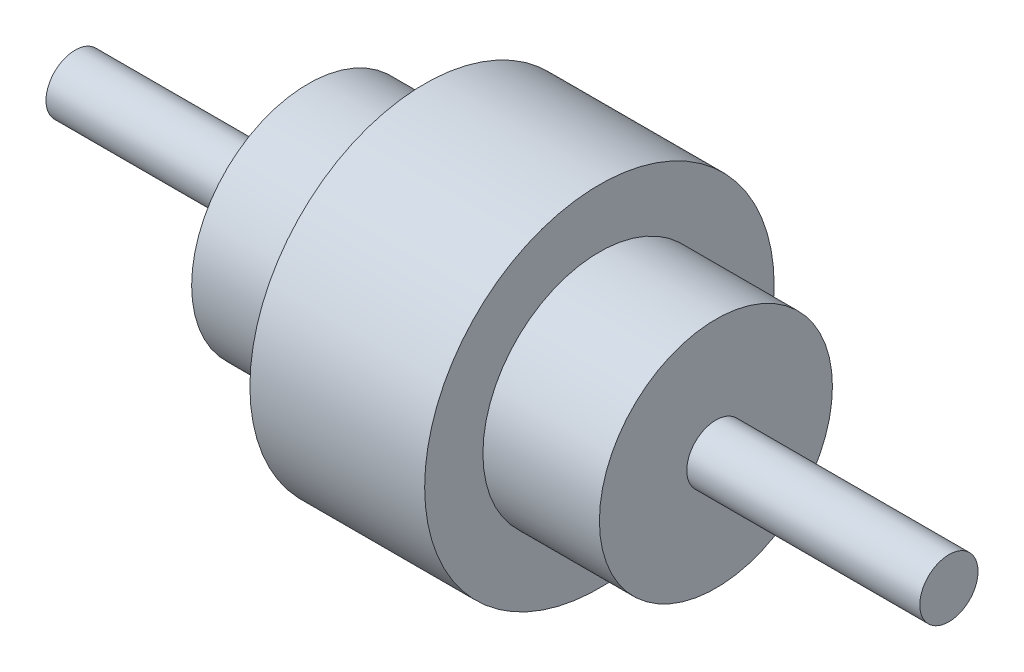
ISO-10303-21;
HEADER;
FILE_DESCRIPTION(('STEP AP214'),'2;1');
FILE_NAME('part.step','',(''),(''),'','','');
FILE_SCHEMA(('AUTOMOTIVE_DESIGN { 1 0 10303 214 1 1 1 1 }'));
ENDSEC;
DATA;
#1=APPLICATION_CONTEXT('core data for automotive mechanical design processes');
#2=APPLICATION_PROTOCOL_DEFINITION('international standard','automotive_design',2000,#1);
#3=PRODUCT_CONTEXT('',#1,'mechanical');
#4=PRODUCT('Part','Part','',(#3));
#5=PRODUCT_RELATED_PRODUCT_CATEGORY('part','',(#4));
#6=PRODUCT_DEFINITION_FORMATION('','',#4);
#7=PRODUCT_DEFINITION_CONTEXT('part definition',#1,'design');
#8=PRODUCT_DEFINITION('design','',#6,#7);
#9=PRODUCT_DEFINITION_SHAPE('','',#8);
#10=(LENGTH_UNIT() NAMED_UNIT(*) SI_UNIT(.MILLI.,.METRE.));
#11=(NAMED_UNIT(*) PLANE_ANGLE_UNIT() SI_UNIT($,.RADIAN.));
#12=(NAMED_UNIT(*) SI_UNIT($,.STERADIAN.) SOLID_ANGLE_UNIT());
#13=UNCERTAINTY_MEASURE_WITH_UNIT(LENGTH_MEASURE(1.E-05),#10,'distance_accuracy_value','');
#14=(GEOMETRIC_REPRESENTATION_CONTEXT(3) GLOBAL_UNCERTAINTY_ASSIGNED_CONTEXT((#13)) GLOBAL_UNIT_ASSIGNED_CONTEXT((#10,
#11,#12)) REPRESENTATION_CONTEXT('',''));
#15=CARTESIAN_POINT('',(0.,0.,0.));
#16=DIRECTION('',(0.,0.,1.));
#17=DIRECTION('',(1.,0.,0.));
#18=AXIS2_PLACEMENT_3D('',#15,#16,#17);
#19=CARTESIAN_POINT('',(0.,0.,0.));
#20=DIRECTION('',(-1.,0.,0.));
#21=DIRECTION('',(0.,0.,1.));
#22=AXIS2_PLACEMENT_3D('',#19,#20,#21);
#23=PLANE('',#22);
#24=CARTESIAN_POINT('',(0.,0.,0.));
#25=DIRECTION('',(-1.,0.,0.));
#26=DIRECTION('',(0.,0.,1.));
#27=AXIS2_PLACEMENT_3D('',#24,#25,#26);
#28=CIRCLE('',#27,10.);
#29=CARTESIAN_POINT('',(0.,0.,10.));
#30=VERTEX_POINT('',#29);
#31=EDGE_CURVE('E10',#30,#30,#28,.T.);
#32=ORIENTED_EDGE('',*,*,#31,.T.);
#33=EDGE_LOOP('',(#32));
#34=FACE_BOUND('',#33,.T.);
#35=ADVANCED_FACE('F41',(#34),#23,.T.);
#36=CARTESIAN_POINT('',(0.,0.,0.));
#37=DIRECTION('',(-1.,0.,0.));
#38=DIRECTION('',(0.,0.,1.));
#39=AXIS2_PLACEMENT_3D('',#36,#37,#38);
#40=CYLINDRICAL_SURFACE('',#39,10.);
#41=CARTESIAN_POINT('',(80.,0.,0.));
#42=DIRECTION('',(-1.,0.,0.));
#43=DIRECTION('',(0.,0.,1.));
#44=AXIS2_PLACEMENT_3D('',#41,#42,#43);
#45=CIRCLE('',#44,10.);
#46=CARTESIAN_POINT('',(80.,0.,10.));
#47=VERTEX_POINT('',#46);
#48=EDGE_CURVE('E48',#47,#47,#45,.T.);
#49=ORIENTED_EDGE('',*,*,#48,.T.);
#50=EDGE_LOOP('',(#49));
#51=FACE_BOUND('',#50,.T.);
#52=ORIENTED_EDGE('',*,*,#31,.F.);
#53=EDGE_LOOP('',(#52));
#54=FACE_BOUND('',#53,.T.);
#55=ADVANCED_FACE('F101',(#51,#54),#40,.T.);
#56=CARTESIAN_POINT('',(80.,0.,10.));
#57=DIRECTION('',(-1.,0.,0.));
#58=DIRECTION('',(0.,0.,1.));
#59=AXIS2_PLACEMENT_3D('',#56,#57,#58);
#60=PLANE('',#59);
#61=CARTESIAN_POINT('',(80.,0.,0.));
#62=DIRECTION('',(-1.,0.,0.));
#63=DIRECTION('',(0.,0.,1.));
#64=AXIS2_PLACEMENT_3D('',#61,#62,#63);
#65=CIRCLE('',#64,40.);
#66=CARTESIAN_POINT('',(80.,0.,40.));
#67=VERTEX_POINT('',#66);
#68=EDGE_CURVE('E53',#67,#67,#65,.T.);
#69=ORIENTED_EDGE('',*,*,#68,.T.);
#70=EDGE_LOOP('',(#69));
#71=FACE_BOUND('',#70,.T.);
#72=ORIENTED_EDGE('',*,*,#48,.F.);
#73=EDGE_LOOP('',(#72));
#74=FACE_BOUND('',#73,.T.);
#75=ADVANCED_FACE('F105',(#71,#74),#60,.T.);
#76=CARTESIAN_POINT('',(0.,0.,0.));
#77=DIRECTION('',(-1.,0.,0.));
#78=DIRECTION('',(0.,0.,1.));
#79=AXIS2_PLACEMENT_3D('',#76,#77,#78);
#80=CYLINDRICAL_SURFACE('',#79,40.);
#81=CARTESIAN_POINT('',(120.,0.,0.));
#82=DIRECTION('',(-1.,0.,0.));
#83=DIRECTION('',(0.,0.,1.));
#84=AXIS2_PLACEMENT_3D('',#81,#82,#83);
#85=CIRCLE('',#84,40.);
#86=CARTESIAN_POINT('',(120.,0.,40.));
#87=VERTEX_POINT('',#86);
#88=EDGE_CURVE('E58',#87,#87,#85,.T.);
#89=ORIENTED_EDGE('',*,*,#88,.T.);
#90=EDGE_LOOP('',(#89));
#91=FACE_BOUND('',#90,.T.);
#92=ORIENTED_EDGE('',*,*,#68,.F.);
#93=EDGE_LOOP('',(#92));
#94=FACE_BOUND('',#93,.T.);
#95=ADVANCED_FACE('F109',(#91,#94),#80,.T.);
#96=CARTESIAN_POINT('',(120.,0.,40.));
#97=DIRECTION('',(-1.,0.,0.));
#98=DIRECTION('',(0.,0.,1.));
#99=AXIS2_PLACEMENT_3D('',#96,#97,#98);
#100=PLANE('',#99);
#101=CARTESIAN_POINT('',(120.,0.,0.));
#102=DIRECTION('',(-1.,0.,0.));
#103=DIRECTION('',(0.,0.,1.));
#104=AXIS2_PLACEMENT_3D('',#101,#102,#103);
#105=CIRCLE('',#104,60.);
#106=CARTESIAN_POINT('',(120.,0.,60.));
#107=VERTEX_POINT('',#106);
#108=EDGE_CURVE('E64',#107,#107,#105,.T.);
#109=ORIENTED_EDGE('',*,*,#108,.T.);
#110=EDGE_LOOP('',(#109));
#111=FACE_BOUND('',#110,.T.);
#112=ORIENTED_EDGE('',*,*,#88,.F.);
#113=EDGE_LOOP('',(#112));
#114=FACE_BOUND('',#113,.T.);
#115=ADVANCED_FACE('F116',(#111,#114),#100,.T.);
#116=CARTESIAN_POINT('',(0.,0.,0.));
#117=DIRECTION('',(-1.,0.,0.));
#118=DIRECTION('',(0.,0.,1.));
#119=AXIS2_PLACEMENT_3D('',#116,#117,#118);
#120=CYLINDRICAL_SURFACE('',#119,60.);
#121=CARTESIAN_POINT('',(180.,0.,0.));
#122=DIRECTION('',(-1.,0.,0.));
#123=DIRECTION('',(0.,0.,1.));
#124=AXIS2_PLACEMENT_3D('',#121,#122,#123);
#125=CIRCLE('',#124,60.);
#126=CARTESIAN_POINT('',(180.,0.,60.));
#127=VERTEX_POINT('',#126);
#128=EDGE_CURVE('E68',#127,#127,#125,.T.);
#129=ORIENTED_EDGE('',*,*,#128,.T.);
#130=EDGE_LOOP('',(#129));
#131=FACE_BOUND('',#130,.T.);
#132=ORIENTED_EDGE('',*,*,#108,.F.);
#133=EDGE_LOOP('',(#132));
#134=FACE_BOUND('',#133,.T.);
#135=ADVANCED_FACE('F120',(#131,#134),#120,.T.);
#136=CARTESIAN_POINT('',(180.,0.,40.));
#137=DIRECTION('',(1.,0.,0.));
#138=DIRECTION('',(0.,0.,-1.));
#139=AXIS2_PLACEMENT_3D('',#136,#137,#138);
#140=PLANE('',#139);
#141=CARTESIAN_POINT('',(180.,0.,0.));
#142=DIRECTION('',(-1.,0.,0.));
#143=DIRECTION('',(0.,0.,1.));
#144=AXIS2_PLACEMENT_3D('',#141,#142,#143);
#145=CIRCLE('',#144,40.);
#146=CARTESIAN_POINT('',(180.,0.,40.));
#147=VERTEX_POINT('',#146);
#148=EDGE_CURVE('E72',#147,#147,#145,.T.);
#149=ORIENTED_EDGE('',*,*,#148,.T.);
#150=EDGE_LOOP('',(#149));
#151=FACE_BOUND('',#150,.T.);
#152=ORIENTED_EDGE('',*,*,#128,.F.);
#153=EDGE_LOOP('',(#152));
#154=FACE_BOUND('',#153,.T.);
#155=ADVANCED_FACE('F124',(#151,#154),#140,.T.);
#156=CARTESIAN_POINT('',(0.,0.,0.));
#157=DIRECTION('',(-1.,0.,0.));
#158=DIRECTION('',(0.,0.,1.));
#159=AXIS2_PLACEMENT_3D('',#156,#157,#158);
#160=CYLINDRICAL_SURFACE('',#159,40.);
#161=CARTESIAN_POINT('',(220.,0.,0.));
#162=DIRECTION('',(-1.,0.,0.));
#163=DIRECTION('',(0.,0.,1.));
#164=AXIS2_PLACEMENT_3D('',#161,#162,#163);
#165=CIRCLE('',#164,40.);
#166=CARTESIAN_POINT('',(220.,0.,40.));
#167=VERTEX_POINT('',#166);
#168=EDGE_CURVE('E76',#167,#167,#165,.T.);
#169=ORIENTED_EDGE('',*,*,#168,.T.);
#170=EDGE_LOOP('',(#169));
#171=FACE_BOUND('',#170,.T.);
#172=ORIENTED_EDGE('',*,*,#148,.F.);
#173=EDGE_LOOP('',(#172));
#174=FACE_BOUND('',#173,.T.);
#175=ADVANCED_FACE('F128',(#171,#174),#160,.T.);
#176=CARTESIAN_POINT('',(220.,0.,10.));
#177=DIRECTION('',(1.,0.,0.));
#178=DIRECTION('',(0.,0.,-1.));
#179=AXIS2_PLACEMENT_3D('',#176,#177,#178);
#180=PLANE('',#179);
#181=CARTESIAN_POINT('',(220.,0.,0.));
#182=DIRECTION('',(-1.,0.,0.));
#183=DIRECTION('',(0.,0.,1.));
#184=AXIS2_PLACEMENT_3D('',#181,#182,#183);
#185=CIRCLE('',#184,10.);
#186=CARTESIAN_POINT('',(220.,0.,10.));
#187=VERTEX_POINT('',#186);
#188=EDGE_CURVE('E80',#187,#187,#185,.T.);
#189=ORIENTED_EDGE('',*,*,#188,.T.);
#190=EDGE_LOOP('',(#189));
#191=FACE_BOUND('',#190,.T.);
#192=ORIENTED_EDGE('',*,*,#168,.F.);
#193=EDGE_LOOP('',(#192));
#194=FACE_BOUND('',#193,.T.);
#195=ADVANCED_FACE('F98',(#191,#194),#180,.T.);
#196=CARTESIAN_POINT('',(0.,0.,0.));
#197=DIRECTION('',(-1.,0.,0.));
#198=DIRECTION('',(0.,0.,1.));
#199=AXIS2_PLACEMENT_3D('',#196,#197,#198);
#200=CYLINDRICAL_SURFACE('',#199,10.);
#201=CARTESIAN_POINT('',(300.,0.,0.));
#202=DIRECTION('',(-1.,0.,0.));
#203=DIRECTION('',(0.,0.,1.));
#204=AXIS2_PLACEMENT_3D('',#201,#202,#203);
#205=CIRCLE('',#204,10.);
#206=CARTESIAN_POINT('',(300.,0.,10.));
#207=VERTEX_POINT('',#206);
#208=EDGE_CURVE('E84',#207,#207,#205,.T.);
#209=ORIENTED_EDGE('',*,*,#208,.T.);
#210=EDGE_LOOP('',(#209));
#211=FACE_BOUND('',#210,.T.);
#212=ORIENTED_EDGE('',*,*,#188,.F.);
#213=EDGE_LOOP('',(#212));
#214=FACE_BOUND('',#213,.T.);
#215=ADVANCED_FACE('F89',(#211,#214),#200,.T.);
#216=CARTESIAN_POINT('',(300.,0.,0.));
#217=DIRECTION('',(1.,0.,0.));
#218=DIRECTION('',(0.,0.,-1.));
#219=AXIS2_PLACEMENT_3D('',#216,#217,#218);
#220=PLANE('',#219);
#221=ORIENTED_EDGE('',*,*,#208,.F.);
#222=EDGE_LOOP('',(#221));
#223=FACE_BOUND('',#222,.T.);
#224=ADVANCED_FACE('F92',(#223),#220,.T.);
#225=CLOSED_SHELL('',(#35,#55,#75,#95,#115,#135,#155,#175,#195,#215,#224));
#226=MANIFOLD_SOLID_BREP('B2',#225);
#227=ADVANCED_BREP_SHAPE_REPRESENTATION('',(#18,#226),#14);
#228=SHAPE_DEFINITION_REPRESENTATION(#9,#227);
ENDSEC;
END-ISO-10303-21;
